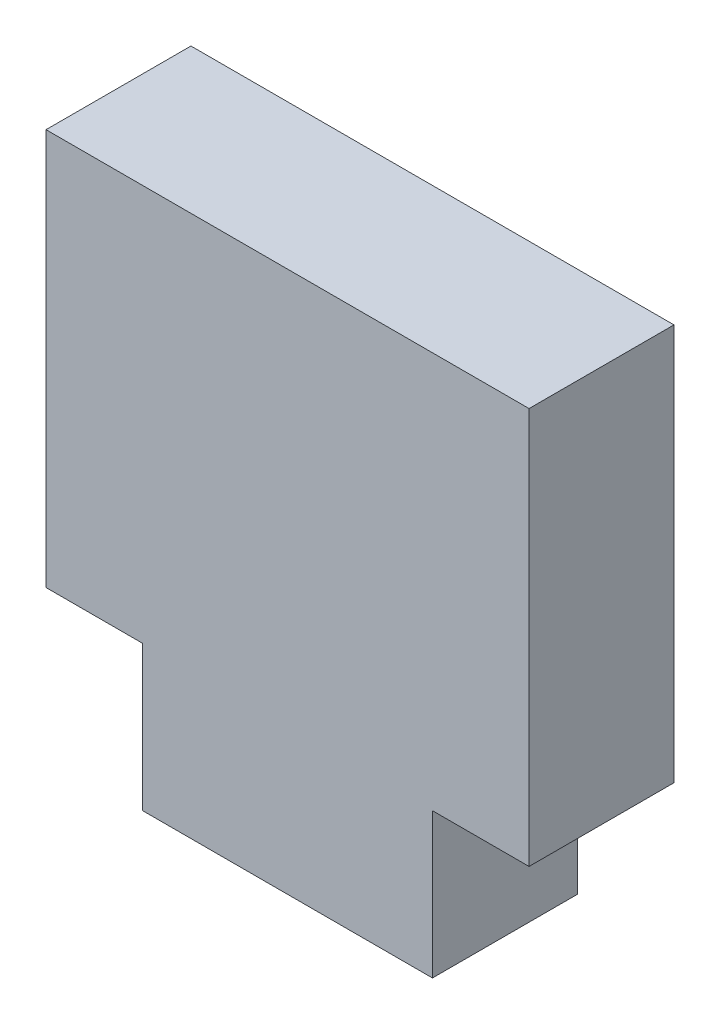
ISO-10303-21;
HEADER;
FILE_DESCRIPTION(('STEP AP214'),'2;1');
FILE_NAME('part.step','',(''),(''),'','','');
FILE_SCHEMA(('AUTOMOTIVE_DESIGN { 1 0 10303 214 1 1 1 1 }'));
ENDSEC;
DATA;
#1=APPLICATION_CONTEXT('core data for automotive mechanical design processes');
#2=APPLICATION_PROTOCOL_DEFINITION('international standard','automotive_design',2000,#1);
#3=PRODUCT_CONTEXT('',#1,'mechanical');
#4=PRODUCT('Part','Part','',(#3));
#5=PRODUCT_RELATED_PRODUCT_CATEGORY('part','',(#4));
#6=PRODUCT_DEFINITION_FORMATION('','',#4);
#7=PRODUCT_DEFINITION_CONTEXT('part definition',#1,'design');
#8=PRODUCT_DEFINITION('design','',#6,#7);
#9=PRODUCT_DEFINITION_SHAPE('','',#8);
#10=(LENGTH_UNIT() NAMED_UNIT(*) SI_UNIT(.MILLI.,.METRE.));
#11=(NAMED_UNIT(*) PLANE_ANGLE_UNIT() SI_UNIT($,.RADIAN.));
#12=(NAMED_UNIT(*) SI_UNIT($,.STERADIAN.) SOLID_ANGLE_UNIT());
#13=UNCERTAINTY_MEASURE_WITH_UNIT(LENGTH_MEASURE(1.E-05),#10,'distance_accuracy_value','');
#14=(GEOMETRIC_REPRESENTATION_CONTEXT(3) GLOBAL_UNCERTAINTY_ASSIGNED_CONTEXT((#13)) GLOBAL_UNIT_ASSIGNED_CONTEXT((#10,
#11,#12)) REPRESENTATION_CONTEXT('',''));
#15=CARTESIAN_POINT('',(0.,0.,0.));
#16=DIRECTION('',(0.,0.,1.));
#17=DIRECTION('',(1.,0.,0.));
#18=AXIS2_PLACEMENT_3D('',#15,#16,#17);
#19=CARTESIAN_POINT('',(0.,-4.105,3.));
#20=DIRECTION('',(0.,1.,0.));
#21=DIRECTION('',(0.,0.,1.));
#22=AXIS2_PLACEMENT_3D('',#19,#20,#21);
#23=PLANE('',#22);
#24=DIRECTION('',(1.,0.,0.));
#25=VECTOR('',#24,1.);
#26=CARTESIAN_POINT('',(0.,-4.105,0.));
#27=LINE('',#26,#25);
#28=CARTESIAN_POINT('',(-5.,-4.105,0.));
#29=VERTEX_POINT('',#28);
#30=CARTESIAN_POINT('',(-3.,-4.105,0.));
#31=VERTEX_POINT('',#30);
#32=EDGE_CURVE('E138',#29,#31,#27,.T.);
#33=ORIENTED_EDGE('',*,*,#32,.T.);
#34=DIRECTION('',(0.,0.,-1.));
#35=VECTOR('',#34,1.);
#36=CARTESIAN_POINT('',(-3.,-4.105,3.));
#37=LINE('',#36,#35);
#38=CARTESIAN_POINT('',(-3.,-4.105,3.));
#39=VERTEX_POINT('',#38);
#40=EDGE_CURVE('E11',#39,#31,#37,.T.);
#41=ORIENTED_EDGE('',*,*,#40,.F.);
#42=DIRECTION('',(1.,0.,0.));
#43=VECTOR('',#42,1.);
#44=CARTESIAN_POINT('',(0.,-4.105,3.));
#45=LINE('',#44,#43);
#46=CARTESIAN_POINT('',(-5.,-4.105,3.));
#47=VERTEX_POINT('',#46);
#48=EDGE_CURVE('E155',#47,#39,#45,.T.);
#49=ORIENTED_EDGE('',*,*,#48,.F.);
#50=DIRECTION('',(0.,0.,-1.));
#51=VECTOR('',#50,1.);
#52=CARTESIAN_POINT('',(-5.,-4.105,3.));
#53=LINE('',#52,#51);
#54=EDGE_CURVE('E56',#47,#29,#53,.T.);
#55=ORIENTED_EDGE('',*,*,#54,.T.);
#56=EDGE_LOOP('',(#33,#41,#49,#55));
#57=FACE_BOUND('',#56,.T.);
#58=ADVANCED_FACE('F39',(#57),#23,.F.);
#59=CARTESIAN_POINT('',(-3.,0.,3.));
#60=DIRECTION('',(1.,0.,0.));
#61=DIRECTION('',(0.,1.,0.));
#62=AXIS2_PLACEMENT_3D('',#59,#60,#61);
#63=PLANE('',#62);
#64=DIRECTION('',(0.,-1.,0.));
#65=VECTOR('',#64,1.);
#66=CARTESIAN_POINT('',(-3.,0.,0.));
#67=LINE('',#66,#65);
#68=CARTESIAN_POINT('',(-3.,-7.105,0.));
#69=VERTEX_POINT('',#68);
#70=EDGE_CURVE('E140',#31,#69,#67,.T.);
#71=ORIENTED_EDGE('',*,*,#70,.T.);
#72=DIRECTION('',(0.,0.,-1.));
#73=VECTOR('',#72,1.);
#74=CARTESIAN_POINT('',(-3.,-7.105,3.));
#75=LINE('',#74,#73);
#76=CARTESIAN_POINT('',(-3.,-7.105,3.));
#77=VERTEX_POINT('',#76);
#78=EDGE_CURVE('E48',#77,#69,#75,.T.);
#79=ORIENTED_EDGE('',*,*,#78,.F.);
#80=DIRECTION('',(0.,-1.,0.));
#81=VECTOR('',#80,1.);
#82=CARTESIAN_POINT('',(-3.,0.,3.));
#83=LINE('',#82,#81);
#84=EDGE_CURVE('E94',#39,#77,#83,.T.);
#85=ORIENTED_EDGE('',*,*,#84,.F.);
#86=ORIENTED_EDGE('',*,*,#40,.T.);
#87=EDGE_LOOP('',(#71,#79,#85,#86));
#88=FACE_BOUND('',#87,.T.);
#89=ADVANCED_FACE('F41',(#88),#63,.F.);
#90=CARTESIAN_POINT('',(0.,-7.105,3.));
#91=DIRECTION('',(0.,1.,0.));
#92=DIRECTION('',(-1.,0.,0.));
#93=AXIS2_PLACEMENT_3D('',#90,#91,#92);
#94=PLANE('',#93);
#95=DIRECTION('',(1.,0.,0.));
#96=VECTOR('',#95,1.);
#97=CARTESIAN_POINT('',(0.,-7.105,0.));
#98=LINE('',#97,#96);
#99=CARTESIAN_POINT('',(3.,-7.105,0.));
#100=VERTEX_POINT('',#99);
#101=EDGE_CURVE('E143',#69,#100,#98,.T.);
#102=ORIENTED_EDGE('',*,*,#101,.T.);
#103=DIRECTION('',(0.,0.,-1.));
#104=VECTOR('',#103,1.);
#105=CARTESIAN_POINT('',(3.,-7.105,3.));
#106=LINE('',#105,#104);
#107=CARTESIAN_POINT('',(3.,-7.105,3.));
#108=VERTEX_POINT('',#107);
#109=EDGE_CURVE('E161',#108,#100,#106,.T.);
#110=ORIENTED_EDGE('',*,*,#109,.F.);
#111=DIRECTION('',(1.,0.,0.));
#112=VECTOR('',#111,1.);
#113=CARTESIAN_POINT('',(0.,-7.105,3.));
#114=LINE('',#113,#112);
#115=EDGE_CURVE('E168',#77,#108,#114,.T.);
#116=ORIENTED_EDGE('',*,*,#115,.F.);
#117=ORIENTED_EDGE('',*,*,#78,.T.);
#118=EDGE_LOOP('',(#102,#110,#116,#117));
#119=FACE_BOUND('',#118,.T.);
#120=ADVANCED_FACE('F166',(#119),#94,.F.);
#121=CARTESIAN_POINT('',(3.00000000000001,0.,3.));
#122=DIRECTION('',(1.,0.,0.));
#123=DIRECTION('',(0.,1.,0.));
#124=AXIS2_PLACEMENT_3D('',#121,#122,#123);
#125=PLANE('',#124);
#126=DIRECTION('',(0.,-1.,0.));
#127=VECTOR('',#126,1.);
#128=CARTESIAN_POINT('',(3.00000000000001,0.,0.));
#129=LINE('',#128,#127);
#130=CARTESIAN_POINT('',(3.,-4.105,0.));
#131=VERTEX_POINT('',#130);
#132=EDGE_CURVE('E146',#131,#100,#129,.T.);
#133=ORIENTED_EDGE('',*,*,#132,.F.);
#134=DIRECTION('',(0.,0.,-1.));
#135=VECTOR('',#134,1.);
#136=CARTESIAN_POINT('',(3.,-4.105,3.));
#137=LINE('',#136,#135);
#138=CARTESIAN_POINT('',(3.,-4.105,3.));
#139=VERTEX_POINT('',#138);
#140=EDGE_CURVE('E159',#139,#131,#137,.T.);
#141=ORIENTED_EDGE('',*,*,#140,.F.);
#142=DIRECTION('',(0.,-1.,0.));
#143=VECTOR('',#142,1.);
#144=CARTESIAN_POINT('',(3.00000000000001,0.,3.));
#145=LINE('',#144,#143);
#146=EDGE_CURVE('E176',#139,#108,#145,.T.);
#147=ORIENTED_EDGE('',*,*,#146,.T.);
#148=ORIENTED_EDGE('',*,*,#109,.T.);
#149=EDGE_LOOP('',(#133,#141,#147,#148));
#150=FACE_BOUND('',#149,.T.);
#151=ADVANCED_FACE('F174',(#150),#125,.T.);
#152=CARTESIAN_POINT('',(5.,-4.105,0.));
#153=VERTEX_POINT('',#152);
#154=EDGE_CURVE('E141',#131,#153,#27,.T.);
#155=ORIENTED_EDGE('',*,*,#154,.T.);
#156=DIRECTION('',(0.,0.,-1.));
#157=VECTOR('',#156,1.);
#158=CARTESIAN_POINT('',(5.,-4.105,3.));
#159=LINE('',#158,#157);
#160=CARTESIAN_POINT('',(5.,-4.105,3.));
#161=VERTEX_POINT('',#160);
#162=EDGE_CURVE('E130',#161,#153,#159,.T.);
#163=ORIENTED_EDGE('',*,*,#162,.F.);
#164=EDGE_CURVE('E118',#139,#161,#45,.T.);
#165=ORIENTED_EDGE('',*,*,#164,.F.);
#166=ORIENTED_EDGE('',*,*,#140,.T.);
#167=EDGE_LOOP('',(#155,#163,#165,#166));
#168=FACE_BOUND('',#167,.T.);
#169=ADVANCED_FACE('F187',(#168),#23,.F.);
#170=CARTESIAN_POINT('',(5.,0.,3.));
#171=DIRECTION('',(-1.,0.,0.));
#172=DIRECTION('',(0.,0.,1.));
#173=AXIS2_PLACEMENT_3D('',#170,#171,#172);
#174=PLANE('',#173);
#175=DIRECTION('',(0.,1.,0.));
#176=VECTOR('',#175,1.);
#177=CARTESIAN_POINT('',(5.,0.,0.));
#178=LINE('',#177,#176);
#179=CARTESIAN_POINT('',(5.,4.105,0.));
#180=VERTEX_POINT('',#179);
#181=EDGE_CURVE('E127',#153,#180,#178,.T.);
#182=ORIENTED_EDGE('',*,*,#181,.T.);
#183=DIRECTION('',(0.,0.,-1.));
#184=VECTOR('',#183,1.);
#185=CARTESIAN_POINT('',(5.,4.105,3.));
#186=LINE('',#185,#184);
#187=CARTESIAN_POINT('',(5.,4.105,3.));
#188=VERTEX_POINT('',#187);
#189=EDGE_CURVE('E124',#188,#180,#186,.T.);
#190=ORIENTED_EDGE('',*,*,#189,.F.);
#191=DIRECTION('',(0.,1.,0.));
#192=VECTOR('',#191,1.);
#193=CARTESIAN_POINT('',(5.,0.,3.));
#194=LINE('',#193,#192);
#195=EDGE_CURVE('E110',#161,#188,#194,.T.);
#196=ORIENTED_EDGE('',*,*,#195,.F.);
#197=ORIENTED_EDGE('',*,*,#162,.T.);
#198=EDGE_LOOP('',(#182,#190,#196,#197));
#199=FACE_BOUND('',#198,.T.);
#200=ADVANCED_FACE('F125',(#199),#174,.F.);
#201=CARTESIAN_POINT('',(0.,4.105,3.));
#202=DIRECTION('',(0.,1.,0.));
#203=DIRECTION('',(0.,0.,1.));
#204=AXIS2_PLACEMENT_3D('',#201,#202,#203);
#205=PLANE('',#204);
#206=DIRECTION('',(1.,0.,0.));
#207=VECTOR('',#206,1.);
#208=CARTESIAN_POINT('',(0.,4.105,0.));
#209=LINE('',#208,#207);
#210=CARTESIAN_POINT('',(-5.,4.105,0.));
#211=VERTEX_POINT('',#210);
#212=EDGE_CURVE('E150',#211,#180,#209,.T.);
#213=ORIENTED_EDGE('',*,*,#212,.F.);
#214=DIRECTION('',(0.,0.,-1.));
#215=VECTOR('',#214,1.);
#216=CARTESIAN_POINT('',(-5.,4.105,3.));
#217=LINE('',#216,#215);
#218=CARTESIAN_POINT('',(-5.,4.105,3.));
#219=VERTEX_POINT('',#218);
#220=EDGE_CURVE('E82',#219,#211,#217,.T.);
#221=ORIENTED_EDGE('',*,*,#220,.F.);
#222=DIRECTION('',(1.,0.,0.));
#223=VECTOR('',#222,1.);
#224=CARTESIAN_POINT('',(0.,4.105,3.));
#225=LINE('',#224,#223);
#226=EDGE_CURVE('E115',#219,#188,#225,.T.);
#227=ORIENTED_EDGE('',*,*,#226,.T.);
#228=ORIENTED_EDGE('',*,*,#189,.T.);
#229=EDGE_LOOP('',(#213,#221,#227,#228));
#230=FACE_BOUND('',#229,.T.);
#231=ADVANCED_FACE('F132',(#230),#205,.T.);
#232=CARTESIAN_POINT('',(-5.,0.,3.));
#233=DIRECTION('',(-1.,0.,0.));
#234=DIRECTION('',(0.,0.,1.));
#235=AXIS2_PLACEMENT_3D('',#232,#233,#234);
#236=PLANE('',#235);
#237=DIRECTION('',(0.,1.,0.));
#238=VECTOR('',#237,1.);
#239=CARTESIAN_POINT('',(-5.,0.,0.));
#240=LINE('',#239,#238);
#241=EDGE_CURVE('E152',#29,#211,#240,.T.);
#242=ORIENTED_EDGE('',*,*,#241,.F.);
#243=ORIENTED_EDGE('',*,*,#54,.F.);
#244=DIRECTION('',(0.,1.,0.));
#245=VECTOR('',#244,1.);
#246=CARTESIAN_POINT('',(-5.,0.,3.));
#247=LINE('',#246,#245);
#248=EDGE_CURVE('E133',#47,#219,#247,.T.);
#249=ORIENTED_EDGE('',*,*,#248,.T.);
#250=ORIENTED_EDGE('',*,*,#220,.T.);
#251=EDGE_LOOP('',(#242,#243,#249,#250));
#252=FACE_BOUND('',#251,.T.);
#253=ADVANCED_FACE('F198',(#252),#236,.T.);
#254=CARTESIAN_POINT('',(0.,0.,3.));
#255=DIRECTION('',(0.,0.,1.));
#256=DIRECTION('',(1.,0.,0.));
#257=AXIS2_PLACEMENT_3D('',#254,#255,#256);
#258=PLANE('',#257);
#259=ORIENTED_EDGE('',*,*,#48,.T.);
#260=ORIENTED_EDGE('',*,*,#84,.T.);
#261=ORIENTED_EDGE('',*,*,#115,.T.);
#262=ORIENTED_EDGE('',*,*,#146,.F.);
#263=ORIENTED_EDGE('',*,*,#164,.T.);
#264=ORIENTED_EDGE('',*,*,#195,.T.);
#265=ORIENTED_EDGE('',*,*,#226,.F.);
#266=ORIENTED_EDGE('',*,*,#248,.F.);
#267=EDGE_LOOP('',(#259,#260,#261,#262,#263,#264,#265,#266));
#268=FACE_BOUND('',#267,.T.);
#269=ADVANCED_FACE('F112',(#268),#258,.T.);
#270=CARTESIAN_POINT('',(0.,0.,0.));
#271=DIRECTION('',(0.,0.,1.));
#272=DIRECTION('',(1.,0.,0.));
#273=AXIS2_PLACEMENT_3D('',#270,#271,#272);
#274=PLANE('',#273);
#275=ORIENTED_EDGE('',*,*,#32,.F.);
#276=ORIENTED_EDGE('',*,*,#241,.T.);
#277=ORIENTED_EDGE('',*,*,#212,.T.);
#278=ORIENTED_EDGE('',*,*,#181,.F.);
#279=ORIENTED_EDGE('',*,*,#154,.F.);
#280=ORIENTED_EDGE('',*,*,#132,.T.);
#281=ORIENTED_EDGE('',*,*,#101,.F.);
#282=ORIENTED_EDGE('',*,*,#70,.F.);
#283=EDGE_LOOP('',(#275,#276,#277,#278,#279,#280,#281,#282));
#284=FACE_BOUND('',#283,.T.);
#285=ADVANCED_FACE('F170',(#284),#274,.F.);
#286=CLOSED_SHELL('',(#58,#89,#120,#151,#169,#200,#231,#253,#269,#285));
#287=MANIFOLD_SOLID_BREP('B2',#286);
#288=ADVANCED_BREP_SHAPE_REPRESENTATION('',(#18,#287),#14);
#289=SHAPE_DEFINITION_REPRESENTATION(#9,#288);
ENDSEC;
END-ISO-10303-21;
